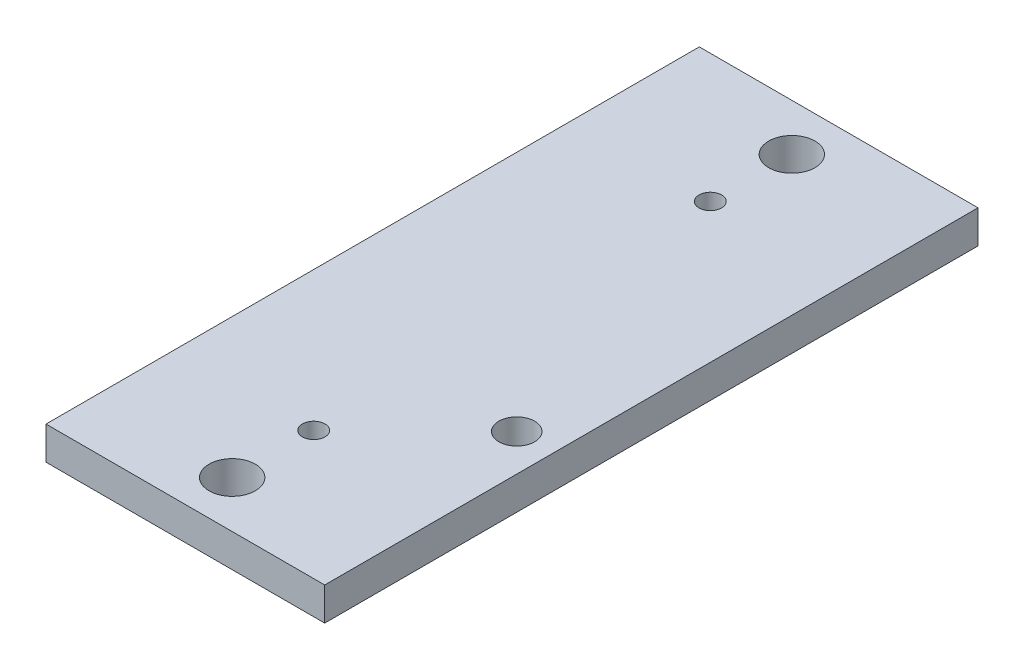
ISO-10303-21;
HEADER;
FILE_DESCRIPTION(('STEP AP214'),'2;1');
FILE_NAME('part.step','',(''),(''),'','','');
FILE_SCHEMA(('AUTOMOTIVE_DESIGN { 1 0 10303 214 1 1 1 1 }'));
ENDSEC;
DATA;
#1=APPLICATION_CONTEXT('core data for automotive mechanical design processes');
#2=APPLICATION_PROTOCOL_DEFINITION('international standard','automotive_design',2000,#1);
#3=PRODUCT_CONTEXT('',#1,'mechanical');
#4=PRODUCT('Part','Part','',(#3));
#5=PRODUCT_RELATED_PRODUCT_CATEGORY('part','',(#4));
#6=PRODUCT_DEFINITION_FORMATION('','',#4);
#7=PRODUCT_DEFINITION_CONTEXT('part definition',#1,'design');
#8=PRODUCT_DEFINITION('design','',#6,#7);
#9=PRODUCT_DEFINITION_SHAPE('','',#8);
#10=(LENGTH_UNIT() NAMED_UNIT(*) SI_UNIT(.MILLI.,.METRE.));
#11=(NAMED_UNIT(*) PLANE_ANGLE_UNIT() SI_UNIT($,.RADIAN.));
#12=(NAMED_UNIT(*) SI_UNIT($,.STERADIAN.) SOLID_ANGLE_UNIT());
#13=UNCERTAINTY_MEASURE_WITH_UNIT(LENGTH_MEASURE(1.E-05),#10,'distance_accuracy_value','');
#14=(GEOMETRIC_REPRESENTATION_CONTEXT(3) GLOBAL_UNCERTAINTY_ASSIGNED_CONTEXT((#13)) GLOBAL_UNIT_ASSIGNED_CONTEXT((#10,
#11,#12)) REPRESENTATION_CONTEXT('',''));
#15=CARTESIAN_POINT('',(0.,0.,0.));
#16=DIRECTION('',(0.,0.,1.));
#17=DIRECTION('',(1.,0.,0.));
#18=AXIS2_PLACEMENT_3D('',#15,#16,#17);
#19=CARTESIAN_POINT('',(0.,3.,0.));
#20=DIRECTION('',(0.,-1.,0.));
#21=DIRECTION('',(0.,0.,-1.));
#22=AXIS2_PLACEMENT_3D('',#19,#20,#21);
#23=PLANE('',#22);
#24=DIRECTION('',(1.,0.,0.));
#25=VECTOR('',#24,1.);
#26=CARTESIAN_POINT('',(-12.65,3.,-29.65));
#27=LINE('',#26,#25);
#28=CARTESIAN_POINT('',(12.65,3.,-29.65));
#29=VERTEX_POINT('',#28);
#30=CARTESIAN_POINT('',(-12.65,3.,-29.65));
#31=VERTEX_POINT('',#30);
#32=EDGE_CURVE('E291',#29,#31,#27,.F.);
#33=ORIENTED_EDGE('',*,*,#32,.T.);
#34=DIRECTION('',(0.,0.,-1.));
#35=VECTOR('',#34,1.);
#36=CARTESIAN_POINT('',(-12.65,3.,29.65));
#37=LINE('',#36,#35);
#38=CARTESIAN_POINT('',(-12.65,3.,29.65));
#39=VERTEX_POINT('',#38);
#40=EDGE_CURVE('E54',#31,#39,#37,.F.);
#41=ORIENTED_EDGE('',*,*,#40,.T.);
#42=DIRECTION('',(-1.,0.,0.));
#43=VECTOR('',#42,1.);
#44=CARTESIAN_POINT('',(-12.65,3.,29.65));
#45=LINE('',#44,#43);
#46=CARTESIAN_POINT('',(12.65,3.,29.65));
#47=VERTEX_POINT('',#46);
#48=EDGE_CURVE('E69',#39,#47,#45,.F.);
#49=ORIENTED_EDGE('',*,*,#48,.T.);
#50=DIRECTION('',(0.,0.,1.));
#51=VECTOR('',#50,1.);
#52=CARTESIAN_POINT('',(12.65,3.,29.65));
#53=LINE('',#52,#51);
#54=EDGE_CURVE('E59',#47,#29,#53,.F.);
#55=ORIENTED_EDGE('',*,*,#54,.T.);
#56=EDGE_LOOP('',(#33,#41,#49,#55));
#57=FACE_BOUND('',#56,.T.);
#58=CARTESIAN_POINT('',(9.3,3.,8.87));
#59=DIRECTION('',(0.,-1.,0.));
#60=DIRECTION('',(0.,0.,-1.));
#61=AXIS2_PLACEMENT_3D('',#58,#59,#60);
#62=CIRCLE('',#61,1.625);
#63=CARTESIAN_POINT('',(9.3,3.,7.245));
#64=VERTEX_POINT('',#63);
#65=EDGE_CURVE('E67',#64,#64,#62,.T.);
#66=ORIENTED_EDGE('',*,*,#65,.T.);
#67=EDGE_LOOP('',(#66));
#68=FACE_BOUND('',#67,.T.);
#69=CARTESIAN_POINT('',(0.,3.,18.));
#70=DIRECTION('',(0.,-1.,0.));
#71=DIRECTION('',(0.,0.,-1.));
#72=AXIS2_PLACEMENT_3D('',#69,#70,#71);
#73=CIRCLE('',#72,1.025);
#74=CARTESIAN_POINT('',(0.,3.,16.975));
#75=VERTEX_POINT('',#74);
#76=EDGE_CURVE('E99',#75,#75,#73,.T.);
#77=ORIENTED_EDGE('',*,*,#76,.T.);
#78=EDGE_LOOP('',(#77));
#79=FACE_BOUND('',#78,.T.);
#80=CARTESIAN_POINT('',(0.,3.,-25.4));
#81=DIRECTION('',(0.,-1.,0.));
#82=DIRECTION('',(0.,0.,-1.));
#83=AXIS2_PLACEMENT_3D('',#80,#81,#82);
#84=CIRCLE('',#83,2.1);
#85=CARTESIAN_POINT('',(0.,3.,-27.5));
#86=VERTEX_POINT('',#85);
#87=EDGE_CURVE('E102',#86,#86,#84,.T.);
#88=ORIENTED_EDGE('',*,*,#87,.T.);
#89=EDGE_LOOP('',(#88));
#90=FACE_BOUND('',#89,.T.);
#91=CARTESIAN_POINT('',(0.,3.,-18.));
#92=DIRECTION('',(0.,-1.,0.));
#93=DIRECTION('',(0.,0.,-1.));
#94=AXIS2_PLACEMENT_3D('',#91,#92,#93);
#95=CIRCLE('',#94,1.025);
#96=CARTESIAN_POINT('',(0.,3.,-19.025));
#97=VERTEX_POINT('',#96);
#98=EDGE_CURVE('E104',#97,#97,#95,.T.);
#99=ORIENTED_EDGE('',*,*,#98,.T.);
#100=EDGE_LOOP('',(#99));
#101=FACE_BOUND('',#100,.T.);
#102=CARTESIAN_POINT('',(0.,3.,25.4));
#103=DIRECTION('',(0.,-1.,0.));
#104=DIRECTION('',(0.,0.,-1.));
#105=AXIS2_PLACEMENT_3D('',#102,#103,#104);
#106=CIRCLE('',#105,2.1);
#107=CARTESIAN_POINT('',(0.,3.,23.3));
#108=VERTEX_POINT('',#107);
#109=EDGE_CURVE('E19',#108,#108,#106,.T.);
#110=ORIENTED_EDGE('',*,*,#109,.T.);
#111=EDGE_LOOP('',(#110));
#112=FACE_BOUND('',#111,.T.);
#113=ADVANCED_FACE('F16',(#57,#68,#79,#90,#101,#112),#23,.F.);
#114=CARTESIAN_POINT('',(0.,0.,25.4));
#115=DIRECTION('',(0.,-1.,0.));
#116=DIRECTION('',(0.,0.,-1.));
#117=AXIS2_PLACEMENT_3D('',#114,#115,#116);
#118=CYLINDRICAL_SURFACE('',#117,2.1);
#119=CARTESIAN_POINT('',(0.,0.,25.4));
#120=DIRECTION('',(0.,-1.,0.));
#121=DIRECTION('',(0.,0.,-1.));
#122=AXIS2_PLACEMENT_3D('',#119,#120,#121);
#123=CIRCLE('',#122,2.1);
#124=CARTESIAN_POINT('',(0.,0.,23.3));
#125=VERTEX_POINT('',#124);
#126=EDGE_CURVE('E94',#125,#125,#123,.F.);
#127=ORIENTED_EDGE('',*,*,#126,.F.);
#128=EDGE_LOOP('',(#127));
#129=FACE_BOUND('',#128,.T.);
#130=ORIENTED_EDGE('',*,*,#109,.F.);
#131=EDGE_LOOP('',(#130));
#132=FACE_BOUND('',#131,.T.);
#133=ADVANCED_FACE('F112',(#129,#132),#118,.F.);
#134=CARTESIAN_POINT('',(0.,0.,-18.));
#135=DIRECTION('',(0.,-1.,0.));
#136=DIRECTION('',(0.,0.,-1.));
#137=AXIS2_PLACEMENT_3D('',#134,#135,#136);
#138=CYLINDRICAL_SURFACE('',#137,1.025);
#139=CARTESIAN_POINT('',(0.,0.,-18.));
#140=DIRECTION('',(0.,-1.,0.));
#141=DIRECTION('',(0.,0.,-1.));
#142=AXIS2_PLACEMENT_3D('',#139,#140,#141);
#143=CIRCLE('',#142,1.025);
#144=CARTESIAN_POINT('',(0.,0.,-19.025));
#145=VERTEX_POINT('',#144);
#146=EDGE_CURVE('E91',#145,#145,#143,.F.);
#147=ORIENTED_EDGE('',*,*,#146,.F.);
#148=EDGE_LOOP('',(#147));
#149=FACE_BOUND('',#148,.T.);
#150=ORIENTED_EDGE('',*,*,#98,.F.);
#151=EDGE_LOOP('',(#150));
#152=FACE_BOUND('',#151,.T.);
#153=ADVANCED_FACE('F114',(#149,#152),#138,.F.);
#154=CARTESIAN_POINT('',(0.,0.,-25.4));
#155=DIRECTION('',(0.,-1.,0.));
#156=DIRECTION('',(0.,0.,-1.));
#157=AXIS2_PLACEMENT_3D('',#154,#155,#156);
#158=CYLINDRICAL_SURFACE('',#157,2.1);
#159=ORIENTED_EDGE('',*,*,#87,.F.);
#160=EDGE_LOOP('',(#159));
#161=FACE_BOUND('',#160,.T.);
#162=CARTESIAN_POINT('',(0.,0.,-25.4));
#163=DIRECTION('',(0.,-1.,0.));
#164=DIRECTION('',(0.,0.,-1.));
#165=AXIS2_PLACEMENT_3D('',#162,#163,#164);
#166=CIRCLE('',#165,2.1);
#167=CARTESIAN_POINT('',(0.,0.,-27.5));
#168=VERTEX_POINT('',#167);
#169=EDGE_CURVE('E88',#168,#168,#166,.F.);
#170=ORIENTED_EDGE('',*,*,#169,.F.);
#171=EDGE_LOOP('',(#170));
#172=FACE_BOUND('',#171,.T.);
#173=ADVANCED_FACE('F121',(#161,#172),#158,.F.);
#174=CARTESIAN_POINT('',(0.,0.,18.));
#175=DIRECTION('',(0.,-1.,0.));
#176=DIRECTION('',(0.,0.,-1.));
#177=AXIS2_PLACEMENT_3D('',#174,#175,#176);
#178=CYLINDRICAL_SURFACE('',#177,1.025);
#179=CARTESIAN_POINT('',(0.,0.,18.));
#180=DIRECTION('',(0.,-1.,0.));
#181=DIRECTION('',(0.,0.,-1.));
#182=AXIS2_PLACEMENT_3D('',#179,#180,#181);
#183=CIRCLE('',#182,1.025);
#184=CARTESIAN_POINT('',(0.,0.,16.975));
#185=VERTEX_POINT('',#184);
#186=EDGE_CURVE('E85',#185,#185,#183,.F.);
#187=ORIENTED_EDGE('',*,*,#186,.F.);
#188=EDGE_LOOP('',(#187));
#189=FACE_BOUND('',#188,.T.);
#190=ORIENTED_EDGE('',*,*,#76,.F.);
#191=EDGE_LOOP('',(#190));
#192=FACE_BOUND('',#191,.T.);
#193=ADVANCED_FACE('F148',(#189,#192),#178,.F.);
#194=CARTESIAN_POINT('',(9.3,0.,8.87));
#195=DIRECTION('',(0.,-1.,0.));
#196=DIRECTION('',(0.,0.,-1.));
#197=AXIS2_PLACEMENT_3D('',#194,#195,#196);
#198=CYLINDRICAL_SURFACE('',#197,1.625);
#199=ORIENTED_EDGE('',*,*,#65,.F.);
#200=EDGE_LOOP('',(#199));
#201=FACE_BOUND('',#200,.T.);
#202=CARTESIAN_POINT('',(9.3,0.,8.87));
#203=DIRECTION('',(0.,-1.,0.));
#204=DIRECTION('',(0.,0.,-1.));
#205=AXIS2_PLACEMENT_3D('',#202,#203,#204);
#206=CIRCLE('',#205,1.625);
#207=CARTESIAN_POINT('',(9.3,0.,7.245));
#208=VERTEX_POINT('',#207);
#209=EDGE_CURVE('E81',#208,#208,#206,.F.);
#210=ORIENTED_EDGE('',*,*,#209,.F.);
#211=EDGE_LOOP('',(#210));
#212=FACE_BOUND('',#211,.T.);
#213=ADVANCED_FACE('F145',(#201,#212),#198,.F.);
#214=CARTESIAN_POINT('',(12.65,0.,29.65));
#215=DIRECTION('',(-1.,0.,0.));
#216=DIRECTION('',(0.,0.,1.));
#217=AXIS2_PLACEMENT_3D('',#214,#215,#216);
#218=PLANE('',#217);
#219=ORIENTED_EDGE('',*,*,#54,.F.);
#220=DIRECTION('',(0.,1.,0.));
#221=VECTOR('',#220,1.);
#222=CARTESIAN_POINT('',(12.65,0.,29.65));
#223=LINE('',#222,#221);
#224=CARTESIAN_POINT('',(12.65,0.,29.65));
#225=VERTEX_POINT('',#224);
#226=EDGE_CURVE('E62',#47,#225,#223,.F.);
#227=ORIENTED_EDGE('',*,*,#226,.T.);
#228=DIRECTION('',(0.,0.,-1.));
#229=VECTOR('',#228,1.);
#230=CARTESIAN_POINT('',(12.65,0.,0.));
#231=LINE('',#230,#229);
#232=CARTESIAN_POINT('',(12.65,0.,-29.65));
#233=VERTEX_POINT('',#232);
#234=EDGE_CURVE('E84',#233,#225,#231,.F.);
#235=ORIENTED_EDGE('',*,*,#234,.F.);
#236=DIRECTION('',(0.,1.,0.));
#237=VECTOR('',#236,1.);
#238=CARTESIAN_POINT('',(12.65,0.,-29.65));
#239=LINE('',#238,#237);
#240=EDGE_CURVE('E65',#233,#29,#239,.T.);
#241=ORIENTED_EDGE('',*,*,#240,.T.);
#242=EDGE_LOOP('',(#219,#227,#235,#241));
#243=FACE_BOUND('',#242,.T.);
#244=ADVANCED_FACE('F60',(#243),#218,.F.);
#245=CARTESIAN_POINT('',(-12.65,0.,29.65));
#246=DIRECTION('',(0.,0.,-1.));
#247=DIRECTION('',(-1.,0.,0.));
#248=AXIS2_PLACEMENT_3D('',#245,#246,#247);
#249=PLANE('',#248);
#250=DIRECTION('',(0.,1.,0.));
#251=VECTOR('',#250,1.);
#252=CARTESIAN_POINT('',(-12.65,0.,29.65));
#253=LINE('',#252,#251);
#254=CARTESIAN_POINT('',(-12.65,0.,29.65));
#255=VERTEX_POINT('',#254);
#256=EDGE_CURVE('E290',#39,#255,#253,.F.);
#257=ORIENTED_EDGE('',*,*,#256,.T.);
#258=DIRECTION('',(1.,0.,0.));
#259=VECTOR('',#258,1.);
#260=CARTESIAN_POINT('',(0.,0.,29.65));
#261=LINE('',#260,#259);
#262=EDGE_CURVE('E76',#225,#255,#261,.F.);
#263=ORIENTED_EDGE('',*,*,#262,.F.);
#264=ORIENTED_EDGE('',*,*,#226,.F.);
#265=ORIENTED_EDGE('',*,*,#48,.F.);
#266=EDGE_LOOP('',(#257,#263,#264,#265));
#267=FACE_BOUND('',#266,.T.);
#268=ADVANCED_FACE('F74',(#267),#249,.F.);
#269=CARTESIAN_POINT('',(-12.65,0.,29.65));
#270=DIRECTION('',(1.,0.,0.));
#271=DIRECTION('',(0.,0.,-1.));
#272=AXIS2_PLACEMENT_3D('',#269,#270,#271);
#273=PLANE('',#272);
#274=ORIENTED_EDGE('',*,*,#40,.F.);
#275=DIRECTION('',(0.,1.,0.));
#276=VECTOR('',#275,1.);
#277=CARTESIAN_POINT('',(-12.65,0.,-29.65));
#278=LINE('',#277,#276);
#279=CARTESIAN_POINT('',(-12.65,0.,-29.65));
#280=VERTEX_POINT('',#279);
#281=EDGE_CURVE('E34',#31,#280,#278,.F.);
#282=ORIENTED_EDGE('',*,*,#281,.T.);
#283=DIRECTION('',(0.,0.,-1.));
#284=VECTOR('',#283,1.);
#285=CARTESIAN_POINT('',(-12.65,0.,0.));
#286=LINE('',#285,#284);
#287=EDGE_CURVE('E25',#255,#280,#286,.T.);
#288=ORIENTED_EDGE('',*,*,#287,.F.);
#289=ORIENTED_EDGE('',*,*,#256,.F.);
#290=EDGE_LOOP('',(#274,#282,#288,#289));
#291=FACE_BOUND('',#290,.T.);
#292=ADVANCED_FACE('F133',(#291),#273,.F.);
#293=CARTESIAN_POINT('',(-12.65,0.,-29.65));
#294=DIRECTION('',(0.,0.,1.));
#295=DIRECTION('',(1.,0.,0.));
#296=AXIS2_PLACEMENT_3D('',#293,#294,#295);
#297=PLANE('',#296);
#298=ORIENTED_EDGE('',*,*,#32,.F.);
#299=ORIENTED_EDGE('',*,*,#240,.F.);
#300=DIRECTION('',(1.,0.,0.));
#301=VECTOR('',#300,1.);
#302=CARTESIAN_POINT('',(0.,0.,-29.65));
#303=LINE('',#302,#301);
#304=EDGE_CURVE('E11',#280,#233,#303,.T.);
#305=ORIENTED_EDGE('',*,*,#304,.F.);
#306=ORIENTED_EDGE('',*,*,#281,.F.);
#307=EDGE_LOOP('',(#298,#299,#305,#306));
#308=FACE_BOUND('',#307,.T.);
#309=ADVANCED_FACE('F127',(#308),#297,.F.);
#310=CARTESIAN_POINT('',(0.,0.,0.));
#311=DIRECTION('',(0.,-1.,0.));
#312=DIRECTION('',(0.,0.,-1.));
#313=AXIS2_PLACEMENT_3D('',#310,#311,#312);
#314=PLANE('',#313);
#315=ORIENTED_EDGE('',*,*,#287,.T.);
#316=ORIENTED_EDGE('',*,*,#304,.T.);
#317=ORIENTED_EDGE('',*,*,#234,.T.);
#318=ORIENTED_EDGE('',*,*,#262,.T.);
#319=EDGE_LOOP('',(#315,#316,#317,#318));
#320=FACE_BOUND('',#319,.T.);
#321=ORIENTED_EDGE('',*,*,#209,.T.);
#322=EDGE_LOOP('',(#321));
#323=FACE_BOUND('',#322,.T.);
#324=ORIENTED_EDGE('',*,*,#186,.T.);
#325=EDGE_LOOP('',(#324));
#326=FACE_BOUND('',#325,.T.);
#327=ORIENTED_EDGE('',*,*,#169,.T.);
#328=EDGE_LOOP('',(#327));
#329=FACE_BOUND('',#328,.T.);
#330=ORIENTED_EDGE('',*,*,#146,.T.);
#331=EDGE_LOOP('',(#330));
#332=FACE_BOUND('',#331,.T.);
#333=ORIENTED_EDGE('',*,*,#126,.T.);
#334=EDGE_LOOP('',(#333));
#335=FACE_BOUND('',#334,.T.);
#336=ADVANCED_FACE('F125',(#320,#323,#326,#329,#332,#335),#314,.T.);
#337=CLOSED_SHELL('',(#113,#133,#153,#173,#193,#213,#244,#268,#292,#309,#336));
#338=MANIFOLD_SOLID_BREP('B1',#337);
#339=ADVANCED_BREP_SHAPE_REPRESENTATION('',(#18,#338),#14);
#340=SHAPE_DEFINITION_REPRESENTATION(#9,#339);
ENDSEC;
END-ISO-10303-21;
